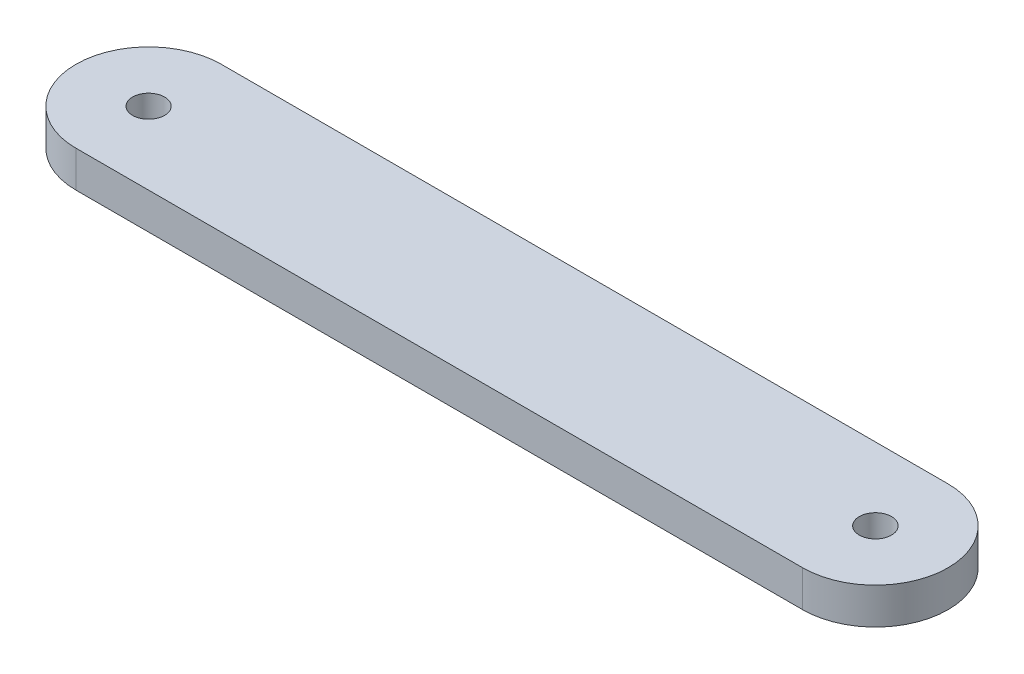
ISO-10303-21;
HEADER;
FILE_DESCRIPTION(('STEP AP214'),'2;1');
FILE_NAME('part.step','',(''),(''),'','','');
FILE_SCHEMA(('AUTOMOTIVE_DESIGN { 1 0 10303 214 1 1 1 1 }'));
ENDSEC;
DATA;
#1=APPLICATION_CONTEXT('core data for automotive mechanical design processes');
#2=APPLICATION_PROTOCOL_DEFINITION('international standard','automotive_design',2000,#1);
#3=PRODUCT_CONTEXT('',#1,'mechanical');
#4=PRODUCT('Part','Part','',(#3));
#5=PRODUCT_RELATED_PRODUCT_CATEGORY('part','',(#4));
#6=PRODUCT_DEFINITION_FORMATION('','',#4);
#7=PRODUCT_DEFINITION_CONTEXT('part definition',#1,'design');
#8=PRODUCT_DEFINITION('design','',#6,#7);
#9=PRODUCT_DEFINITION_SHAPE('','',#8);
#10=(LENGTH_UNIT() NAMED_UNIT(*) SI_UNIT(.MILLI.,.METRE.));
#11=(NAMED_UNIT(*) PLANE_ANGLE_UNIT() SI_UNIT($,.RADIAN.));
#12=(NAMED_UNIT(*) SI_UNIT($,.STERADIAN.) SOLID_ANGLE_UNIT());
#13=UNCERTAINTY_MEASURE_WITH_UNIT(LENGTH_MEASURE(1.E-05),#10,'distance_accuracy_value','');
#14=(GEOMETRIC_REPRESENTATION_CONTEXT(3) GLOBAL_UNCERTAINTY_ASSIGNED_CONTEXT((#13)) GLOBAL_UNIT_ASSIGNED_CONTEXT((#10,
#11,#12)) REPRESENTATION_CONTEXT('',''));
#15=CARTESIAN_POINT('',(0.,0.,0.));
#16=DIRECTION('',(0.,0.,1.));
#17=DIRECTION('',(1.,0.,0.));
#18=AXIS2_PLACEMENT_3D('',#15,#16,#17);
#19=CARTESIAN_POINT('',(0.,6.35,0.));
#20=DIRECTION('',(0.,1.,0.));
#21=DIRECTION('',(0.,0.,1.));
#22=AXIS2_PLACEMENT_3D('',#19,#20,#21);
#23=PLANE('',#22);
#24=CARTESIAN_POINT('',(0.,6.35,0.));
#25=DIRECTION('',(0.,1.,0.));
#26=DIRECTION('',(0.,0.,1.));
#27=AXIS2_PLACEMENT_3D('',#24,#25,#26);
#28=CIRCLE('',#27,2.794);
#29=CARTESIAN_POINT('',(0.,6.35,2.794));
#30=VERTEX_POINT('',#29);
#31=EDGE_CURVE('E102',#30,#30,#28,.T.);
#32=ORIENTED_EDGE('',*,*,#31,.F.);
#33=EDGE_LOOP('',(#32));
#34=FACE_BOUND('',#33,.T.);
#35=CARTESIAN_POINT('',(0.,6.35,0.));
#36=DIRECTION('',(0.,1.,0.));
#37=DIRECTION('',(0.,0.,1.));
#38=AXIS2_PLACEMENT_3D('',#35,#36,#37);
#39=CIRCLE('',#38,12.7);
#40=CARTESIAN_POINT('',(0.,6.35,-12.7));
#41=VERTEX_POINT('',#40);
#42=CARTESIAN_POINT('',(0.,6.35,12.7));
#43=VERTEX_POINT('',#42);
#44=EDGE_CURVE('E87',#41,#43,#39,.T.);
#45=ORIENTED_EDGE('',*,*,#44,.T.);
#46=DIRECTION('',(1.,0.,0.));
#47=VECTOR('',#46,1.);
#48=CARTESIAN_POINT('',(0.,6.35,12.7));
#49=LINE('',#48,#47);
#50=CARTESIAN_POINT('',(127.,6.35,12.7));
#51=VERTEX_POINT('',#50);
#52=EDGE_CURVE('E82',#43,#51,#49,.T.);
#53=ORIENTED_EDGE('',*,*,#52,.T.);
#54=CARTESIAN_POINT('',(127.,6.35,0.));
#55=DIRECTION('',(0.,1.,0.));
#56=DIRECTION('',(0.,0.,1.));
#57=AXIS2_PLACEMENT_3D('',#54,#55,#56);
#58=CIRCLE('',#57,12.7);
#59=CARTESIAN_POINT('',(127.,6.35,-12.7));
#60=VERTEX_POINT('',#59);
#61=EDGE_CURVE('E85',#51,#60,#58,.T.);
#62=ORIENTED_EDGE('',*,*,#61,.T.);
#63=DIRECTION('',(-1.,0.,0.));
#64=VECTOR('',#63,1.);
#65=CARTESIAN_POINT('',(0.,6.35,-12.7));
#66=LINE('',#65,#64);
#67=EDGE_CURVE('E52',#60,#41,#66,.T.);
#68=ORIENTED_EDGE('',*,*,#67,.T.);
#69=EDGE_LOOP('',(#45,#53,#62,#68));
#70=FACE_BOUND('',#69,.T.);
#71=CARTESIAN_POINT('',(127.,6.35,0.));
#72=DIRECTION('',(0.,1.,0.));
#73=DIRECTION('',(0.,0.,1.));
#74=AXIS2_PLACEMENT_3D('',#71,#72,#73);
#75=CIRCLE('',#74,2.81351507634001);
#76=CARTESIAN_POINT('',(127.,6.35,2.81351507634001));
#77=VERTEX_POINT('',#76);
#78=EDGE_CURVE('E117',#77,#77,#75,.T.);
#79=ORIENTED_EDGE('',*,*,#78,.F.);
#80=EDGE_LOOP('',(#79));
#81=FACE_BOUND('',#80,.T.);
#82=ADVANCED_FACE('F35',(#34,#70,#81),#23,.T.);
#83=CARTESIAN_POINT('',(0.,0.,0.));
#84=DIRECTION('',(0.,1.,0.));
#85=DIRECTION('',(0.,0.,1.));
#86=AXIS2_PLACEMENT_3D('',#83,#84,#85);
#87=PLANE('',#86);
#88=CARTESIAN_POINT('',(0.,0.,0.));
#89=DIRECTION('',(0.,1.,0.));
#90=DIRECTION('',(0.,0.,1.));
#91=AXIS2_PLACEMENT_3D('',#88,#89,#90);
#92=CIRCLE('',#91,12.7);
#93=CARTESIAN_POINT('',(0.,0.,-12.7));
#94=VERTEX_POINT('',#93);
#95=CARTESIAN_POINT('',(0.,0.,12.7));
#96=VERTEX_POINT('',#95);
#97=EDGE_CURVE('E99',#94,#96,#92,.T.);
#98=ORIENTED_EDGE('',*,*,#97,.F.);
#99=DIRECTION('',(-1.,0.,0.));
#100=VECTOR('',#99,1.);
#101=CARTESIAN_POINT('',(0.,0.,-12.7));
#102=LINE('',#101,#100);
#103=CARTESIAN_POINT('',(127.,0.,-12.7));
#104=VERTEX_POINT('',#103);
#105=EDGE_CURVE('E75',#104,#94,#102,.T.);
#106=ORIENTED_EDGE('',*,*,#105,.F.);
#107=CARTESIAN_POINT('',(127.,0.,0.));
#108=DIRECTION('',(0.,1.,0.));
#109=DIRECTION('',(0.,0.,1.));
#110=AXIS2_PLACEMENT_3D('',#107,#108,#109);
#111=CIRCLE('',#110,12.7);
#112=CARTESIAN_POINT('',(127.,0.,12.7));
#113=VERTEX_POINT('',#112);
#114=EDGE_CURVE('E69',#113,#104,#111,.T.);
#115=ORIENTED_EDGE('',*,*,#114,.F.);
#116=DIRECTION('',(1.,0.,0.));
#117=VECTOR('',#116,1.);
#118=CARTESIAN_POINT('',(0.,0.,12.7));
#119=LINE('',#118,#117);
#120=EDGE_CURVE('E91',#96,#113,#119,.T.);
#121=ORIENTED_EDGE('',*,*,#120,.F.);
#122=EDGE_LOOP('',(#98,#106,#115,#121));
#123=FACE_BOUND('',#122,.T.);
#124=CARTESIAN_POINT('',(0.,0.,0.));
#125=DIRECTION('',(0.,1.,0.));
#126=DIRECTION('',(0.,0.,1.));
#127=AXIS2_PLACEMENT_3D('',#124,#125,#126);
#128=CIRCLE('',#127,2.794);
#129=CARTESIAN_POINT('',(0.,0.,2.794));
#130=VERTEX_POINT('',#129);
#131=EDGE_CURVE('E114',#130,#130,#128,.T.);
#132=ORIENTED_EDGE('',*,*,#131,.T.);
#133=EDGE_LOOP('',(#132));
#134=FACE_BOUND('',#133,.T.);
#135=CARTESIAN_POINT('',(127.,0.,0.));
#136=DIRECTION('',(0.,1.,0.));
#137=DIRECTION('',(0.,0.,1.));
#138=AXIS2_PLACEMENT_3D('',#135,#136,#137);
#139=CIRCLE('',#138,2.81351507634001);
#140=CARTESIAN_POINT('',(127.,0.,2.81351507634001));
#141=VERTEX_POINT('',#140);
#142=EDGE_CURVE('E120',#141,#141,#139,.T.);
#143=ORIENTED_EDGE('',*,*,#142,.T.);
#144=EDGE_LOOP('',(#143));
#145=FACE_BOUND('',#144,.T.);
#146=ADVANCED_FACE('F110',(#123,#134,#145),#87,.F.);
#147=CARTESIAN_POINT('',(0.,6.35,0.));
#148=DIRECTION('',(0.,-1.,0.));
#149=DIRECTION('',(0.,0.,-1.));
#150=AXIS2_PLACEMENT_3D('',#147,#148,#149);
#151=CYLINDRICAL_SURFACE('',#150,12.7);
#152=ORIENTED_EDGE('',*,*,#97,.T.);
#153=DIRECTION('',(0.,-1.,0.));
#154=VECTOR('',#153,1.);
#155=CARTESIAN_POINT('',(0.,6.35,12.7));
#156=LINE('',#155,#154);
#157=EDGE_CURVE('E11',#43,#96,#156,.T.);
#158=ORIENTED_EDGE('',*,*,#157,.F.);
#159=ORIENTED_EDGE('',*,*,#44,.F.);
#160=DIRECTION('',(0.,-1.,0.));
#161=VECTOR('',#160,1.);
#162=CARTESIAN_POINT('',(0.,6.35,-12.7));
#163=LINE('',#162,#161);
#164=EDGE_CURVE('E95',#41,#94,#163,.T.);
#165=ORIENTED_EDGE('',*,*,#164,.T.);
#166=EDGE_LOOP('',(#152,#158,#159,#165));
#167=FACE_BOUND('',#166,.T.);
#168=ADVANCED_FACE('F37',(#167),#151,.T.);
#169=CARTESIAN_POINT('',(0.,6.35,12.7));
#170=DIRECTION('',(0.,0.,-1.));
#171=DIRECTION('',(-1.,0.,0.));
#172=AXIS2_PLACEMENT_3D('',#169,#170,#171);
#173=PLANE('',#172);
#174=ORIENTED_EDGE('',*,*,#120,.T.);
#175=DIRECTION('',(0.,-1.,0.));
#176=VECTOR('',#175,1.);
#177=CARTESIAN_POINT('',(127.,6.35,12.7));
#178=LINE('',#177,#176);
#179=EDGE_CURVE('E44',#51,#113,#178,.T.);
#180=ORIENTED_EDGE('',*,*,#179,.F.);
#181=ORIENTED_EDGE('',*,*,#52,.F.);
#182=ORIENTED_EDGE('',*,*,#157,.T.);
#183=EDGE_LOOP('',(#174,#180,#181,#182));
#184=FACE_BOUND('',#183,.T.);
#185=ADVANCED_FACE('F90',(#184),#173,.F.);
#186=CARTESIAN_POINT('',(127.,6.35,0.));
#187=DIRECTION('',(0.,-1.,0.));
#188=DIRECTION('',(0.,0.,-1.));
#189=AXIS2_PLACEMENT_3D('',#186,#187,#188);
#190=CYLINDRICAL_SURFACE('',#189,12.7);
#191=ORIENTED_EDGE('',*,*,#114,.T.);
#192=DIRECTION('',(0.,-1.,0.));
#193=VECTOR('',#192,1.);
#194=CARTESIAN_POINT('',(127.,6.35,-12.7));
#195=LINE('',#194,#193);
#196=EDGE_CURVE('E92',#60,#104,#195,.T.);
#197=ORIENTED_EDGE('',*,*,#196,.F.);
#198=ORIENTED_EDGE('',*,*,#61,.F.);
#199=ORIENTED_EDGE('',*,*,#179,.T.);
#200=EDGE_LOOP('',(#191,#197,#198,#199));
#201=FACE_BOUND('',#200,.T.);
#202=ADVANCED_FACE('F93',(#201),#190,.T.);
#203=CARTESIAN_POINT('',(0.,6.35,-12.7));
#204=DIRECTION('',(0.,0.,1.));
#205=DIRECTION('',(1.,0.,0.));
#206=AXIS2_PLACEMENT_3D('',#203,#204,#205);
#207=PLANE('',#206);
#208=ORIENTED_EDGE('',*,*,#105,.T.);
#209=ORIENTED_EDGE('',*,*,#164,.F.);
#210=ORIENTED_EDGE('',*,*,#67,.F.);
#211=ORIENTED_EDGE('',*,*,#196,.T.);
#212=EDGE_LOOP('',(#208,#209,#210,#211));
#213=FACE_BOUND('',#212,.T.);
#214=ADVANCED_FACE('F107',(#213),#207,.F.);
#215=CARTESIAN_POINT('',(0.,6.35,0.));
#216=DIRECTION('',(0.,-1.,0.));
#217=DIRECTION('',(0.,0.,-1.));
#218=AXIS2_PLACEMENT_3D('',#215,#216,#217);
#219=CYLINDRICAL_SURFACE('',#218,2.794);
#220=ORIENTED_EDGE('',*,*,#31,.T.);
#221=EDGE_LOOP('',(#220));
#222=FACE_BOUND('',#221,.T.);
#223=ORIENTED_EDGE('',*,*,#131,.F.);
#224=EDGE_LOOP('',(#223));
#225=FACE_BOUND('',#224,.T.);
#226=ADVANCED_FACE('F137',(#222,#225),#219,.F.);
#227=CARTESIAN_POINT('',(127.,6.35,0.));
#228=DIRECTION('',(0.,-1.,0.));
#229=DIRECTION('',(0.,0.,-1.));
#230=AXIS2_PLACEMENT_3D('',#227,#228,#229);
#231=CYLINDRICAL_SURFACE('',#230,2.81351507634001);
#232=ORIENTED_EDGE('',*,*,#78,.T.);
#233=EDGE_LOOP('',(#232));
#234=FACE_BOUND('',#233,.T.);
#235=ORIENTED_EDGE('',*,*,#142,.F.);
#236=EDGE_LOOP('',(#235));
#237=FACE_BOUND('',#236,.T.);
#238=ADVANCED_FACE('F126',(#234,#237),#231,.F.);
#239=CLOSED_SHELL('',(#82,#146,#168,#185,#202,#214,#226,#238));
#240=MANIFOLD_SOLID_BREP('B2',#239);
#241=ADVANCED_BREP_SHAPE_REPRESENTATION('',(#18,#240),#14);
#242=SHAPE_DEFINITION_REPRESENTATION(#9,#241);
ENDSEC;
END-ISO-10303-21;
